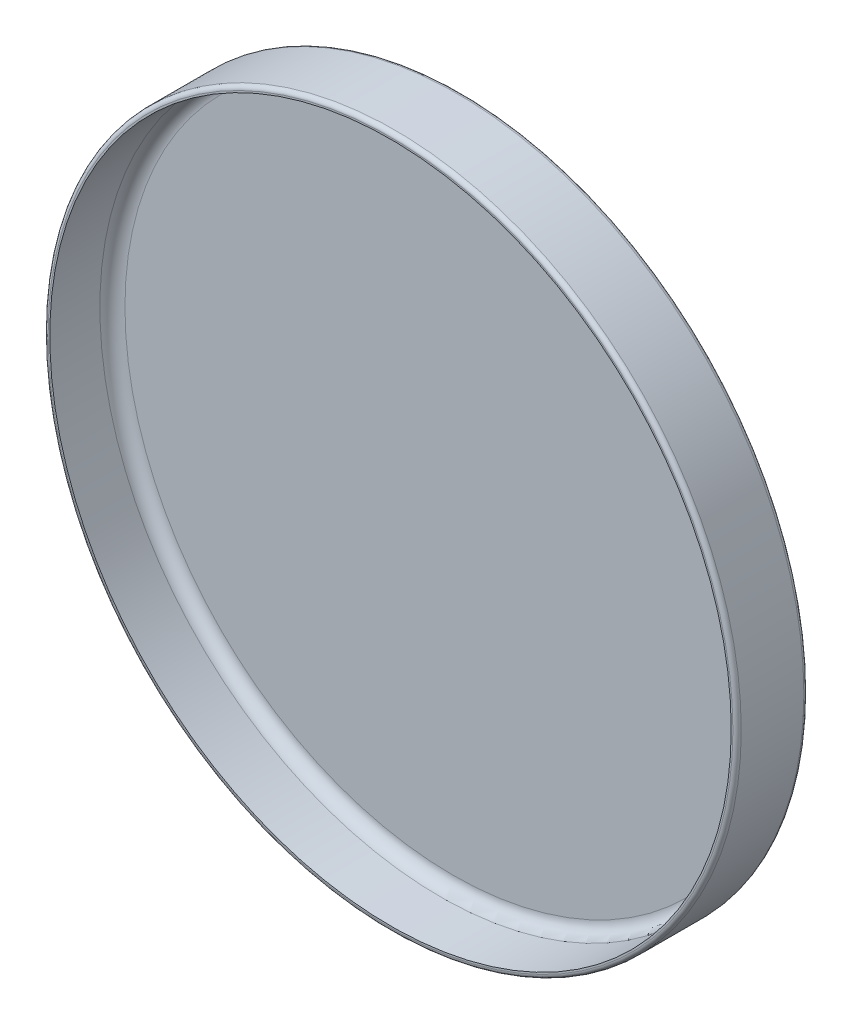
ISO-10303-21;
HEADER;
FILE_DESCRIPTION(('STEP AP214'),'2;1');
FILE_NAME('part.step','',(''),(''),'','','');
FILE_SCHEMA(('AUTOMOTIVE_DESIGN { 1 0 10303 214 1 1 1 1 }'));
ENDSEC;
DATA;
#1=APPLICATION_CONTEXT('core data for automotive mechanical design processes');
#2=APPLICATION_PROTOCOL_DEFINITION('international standard','automotive_design',2000,#1);
#3=PRODUCT_CONTEXT('',#1,'mechanical');
#4=PRODUCT('Part','Part','',(#3));
#5=PRODUCT_RELATED_PRODUCT_CATEGORY('part','',(#4));
#6=PRODUCT_DEFINITION_FORMATION('','',#4);
#7=PRODUCT_DEFINITION_CONTEXT('part definition',#1,'design');
#8=PRODUCT_DEFINITION('design','',#6,#7);
#9=PRODUCT_DEFINITION_SHAPE('','',#8);
#10=(LENGTH_UNIT() NAMED_UNIT(*) SI_UNIT(.MILLI.,.METRE.));
#11=(NAMED_UNIT(*) PLANE_ANGLE_UNIT() SI_UNIT($,.RADIAN.));
#12=(NAMED_UNIT(*) SI_UNIT($,.STERADIAN.) SOLID_ANGLE_UNIT());
#13=UNCERTAINTY_MEASURE_WITH_UNIT(LENGTH_MEASURE(1.E-05),#10,'distance_accuracy_value','');
#14=(GEOMETRIC_REPRESENTATION_CONTEXT(3) GLOBAL_UNCERTAINTY_ASSIGNED_CONTEXT((#13)) GLOBAL_UNIT_ASSIGNED_CONTEXT((#10,
#11,#12)) REPRESENTATION_CONTEXT('',''));
#15=CARTESIAN_POINT('',(0.,0.,0.));
#16=DIRECTION('',(0.,0.,1.));
#17=DIRECTION('',(1.,0.,0.));
#18=AXIS2_PLACEMENT_3D('',#15,#16,#17);
#19=CARTESIAN_POINT('',(0.,0.,-2.));
#20=DIRECTION('',(0.,0.,1.));
#21=DIRECTION('',(1.,0.,0.));
#22=AXIS2_PLACEMENT_3D('',#19,#20,#21);
#23=CYLINDRICAL_SURFACE('',#22,83.);
#24=CARTESIAN_POINT('',(0.,0.,14.));
#25=DIRECTION('',(0.,0.,1.));
#26=DIRECTION('',(1.,0.,0.));
#27=AXIS2_PLACEMENT_3D('',#24,#25,#26);
#28=CIRCLE('',#27,83.);
#29=CARTESIAN_POINT('',(83.,0.,14.));
#30=VERTEX_POINT('',#29);
#31=EDGE_CURVE('E43',#30,#30,#28,.F.);
#32=ORIENTED_EDGE('',*,*,#31,.T.);
#33=EDGE_LOOP('',(#32));
#34=FACE_BOUND('',#33,.T.);
#35=CARTESIAN_POINT('',(0.,0.,-1.));
#36=DIRECTION('',(0.,0.,1.));
#37=DIRECTION('',(1.,0.,0.));
#38=AXIS2_PLACEMENT_3D('',#35,#36,#37);
#39=CIRCLE('',#38,83.);
#40=CARTESIAN_POINT('',(83.,0.,-1.));
#41=VERTEX_POINT('',#40);
#42=EDGE_CURVE('E55',#41,#41,#39,.T.);
#43=ORIENTED_EDGE('',*,*,#42,.T.);
#44=EDGE_LOOP('',(#43));
#45=FACE_BOUND('',#44,.T.);
#46=ADVANCED_FACE('F32',(#34,#45),#23,.T.);
#47=CARTESIAN_POINT('',(0.,0.,-2.));
#48=DIRECTION('',(0.,0.,1.));
#49=DIRECTION('',(1.,0.,0.));
#50=AXIS2_PLACEMENT_3D('',#47,#48,#49);
#51=PLANE('',#50);
#52=CARTESIAN_POINT('',(0.,0.,-2.));
#53=DIRECTION('',(0.,0.,1.));
#54=DIRECTION('',(1.,0.,0.));
#55=AXIS2_PLACEMENT_3D('',#52,#53,#54);
#56=CIRCLE('',#55,82.);
#57=CARTESIAN_POINT('',(82.,0.,-2.));
#58=VERTEX_POINT('',#57);
#59=EDGE_CURVE('E52',#58,#58,#56,.F.);
#60=ORIENTED_EDGE('',*,*,#59,.T.);
#61=EDGE_LOOP('',(#60));
#62=FACE_BOUND('',#61,.T.);
#63=ADVANCED_FACE('F77',(#62),#51,.F.);
#64=CARTESIAN_POINT('',(0.,0.,15.));
#65=DIRECTION('',(0.,0.,-1.));
#66=DIRECTION('',(-1.,0.,0.));
#67=AXIS2_PLACEMENT_3D('',#64,#65,#66);
#68=CYLINDRICAL_SURFACE('',#67,81.6);
#69=CARTESIAN_POINT('',(0.,0.,3.));
#70=DIRECTION('',(0.,0.,1.));
#71=DIRECTION('',(1.,0.,0.));
#72=AXIS2_PLACEMENT_3D('',#69,#70,#71);
#73=CIRCLE('',#72,81.6);
#74=CARTESIAN_POINT('',(81.6,0.,3.));
#75=VERTEX_POINT('',#74);
#76=EDGE_CURVE('E39',#75,#75,#73,.F.);
#77=ORIENTED_EDGE('',*,*,#76,.T.);
#78=EDGE_LOOP('',(#77));
#79=FACE_BOUND('',#78,.T.);
#80=CARTESIAN_POINT('',(0.,0.,15.));
#81=DIRECTION('',(0.,0.,1.));
#82=DIRECTION('',(1.,0.,0.));
#83=AXIS2_PLACEMENT_3D('',#80,#81,#82);
#84=CIRCLE('',#83,81.6);
#85=CARTESIAN_POINT('',(81.6,0.,15.));
#86=VERTEX_POINT('',#85);
#87=EDGE_CURVE('E58',#86,#86,#84,.T.);
#88=ORIENTED_EDGE('',*,*,#87,.T.);
#89=EDGE_LOOP('',(#88));
#90=FACE_BOUND('',#89,.T.);
#91=ADVANCED_FACE('F62',(#79,#90),#68,.F.);
#92=CARTESIAN_POINT('',(0.,0.,15.));
#93=DIRECTION('',(0.,0.,1.));
#94=DIRECTION('',(1.,0.,0.));
#95=AXIS2_PLACEMENT_3D('',#92,#93,#94);
#96=PLANE('',#95);
#97=CARTESIAN_POINT('',(0.,0.,15.));
#98=DIRECTION('',(0.,0.,1.));
#99=DIRECTION('',(1.,0.,0.));
#100=AXIS2_PLACEMENT_3D('',#97,#98,#99);
#101=CIRCLE('',#100,82.);
#102=CARTESIAN_POINT('',(82.,0.,15.));
#103=VERTEX_POINT('',#102);
#104=EDGE_CURVE('E47',#103,#103,#101,.T.);
#105=ORIENTED_EDGE('',*,*,#104,.T.);
#106=EDGE_LOOP('',(#105));
#107=FACE_BOUND('',#106,.T.);
#108=ORIENTED_EDGE('',*,*,#87,.F.);
#109=EDGE_LOOP('',(#108));
#110=FACE_BOUND('',#109,.T.);
#111=ADVANCED_FACE('F64',(#107,#110),#96,.T.);
#112=CARTESIAN_POINT('',(0.,0.,0.));
#113=DIRECTION('',(0.,0.,1.));
#114=DIRECTION('',(1.,0.,0.));
#115=AXIS2_PLACEMENT_3D('',#112,#113,#114);
#116=PLANE('',#115);
#117=CARTESIAN_POINT('',(0.,0.,0.));
#118=DIRECTION('',(0.,0.,1.));
#119=DIRECTION('',(1.,0.,0.));
#120=AXIS2_PLACEMENT_3D('',#117,#118,#119);
#121=CIRCLE('',#120,78.6);
#122=CARTESIAN_POINT('',(78.6,0.,0.));
#123=VERTEX_POINT('',#122);
#124=EDGE_CURVE('E10',#123,#123,#121,.T.);
#125=ORIENTED_EDGE('',*,*,#124,.T.);
#126=EDGE_LOOP('',(#125));
#127=FACE_BOUND('',#126,.T.);
#128=ADVANCED_FACE('F66',(#127),#116,.T.);
#129=CARTESIAN_POINT('',(0.,0.,-1.));
#130=DIRECTION('',(0.,0.,1.));
#131=DIRECTION('',(1.,0.,0.));
#132=AXIS2_PLACEMENT_3D('',#129,#130,#131);
#133=TOROIDAL_SURFACE('',#132,82.,1.);
#134=ORIENTED_EDGE('',*,*,#59,.F.);
#135=EDGE_LOOP('',(#134));
#136=FACE_BOUND('',#135,.T.);
#137=ORIENTED_EDGE('',*,*,#42,.F.);
#138=EDGE_LOOP('',(#137));
#139=FACE_BOUND('',#138,.T.);
#140=ADVANCED_FACE('F74',(#136,#139),#133,.T.);
#141=CARTESIAN_POINT('',(0.,0.,14.));
#142=DIRECTION('',(0.,0.,1.));
#143=DIRECTION('',(1.,0.,0.));
#144=AXIS2_PLACEMENT_3D('',#141,#142,#143);
#145=TOROIDAL_SURFACE('',#144,82.,1.);
#146=ORIENTED_EDGE('',*,*,#31,.F.);
#147=EDGE_LOOP('',(#146));
#148=FACE_BOUND('',#147,.T.);
#149=ORIENTED_EDGE('',*,*,#104,.F.);
#150=EDGE_LOOP('',(#149));
#151=FACE_BOUND('',#150,.T.);
#152=ADVANCED_FACE('F90',(#148,#151),#145,.T.);
#153=CARTESIAN_POINT('',(0.,0.,3.));
#154=DIRECTION('',(0.,0.,1.));
#155=DIRECTION('',(1.,0.,0.));
#156=AXIS2_PLACEMENT_3D('',#153,#154,#155);
#157=TOROIDAL_SURFACE('',#156,78.6,3.);
#158=ORIENTED_EDGE('',*,*,#124,.F.);
#159=EDGE_LOOP('',(#158));
#160=FACE_BOUND('',#159,.T.);
#161=ORIENTED_EDGE('',*,*,#76,.F.);
#162=EDGE_LOOP('',(#161));
#163=FACE_BOUND('',#162,.T.);
#164=ADVANCED_FACE('F34',(#160,#163),#157,.F.);
#165=CLOSED_SHELL('',(#46,#63,#91,#111,#128,#140,#152,#164));
#166=MANIFOLD_SOLID_BREP('B2',#165);
#167=ADVANCED_BREP_SHAPE_REPRESENTATION('',(#18,#166),#14);
#168=SHAPE_DEFINITION_REPRESENTATION(#9,#167);
ENDSEC;
END-ISO-10303-21;
